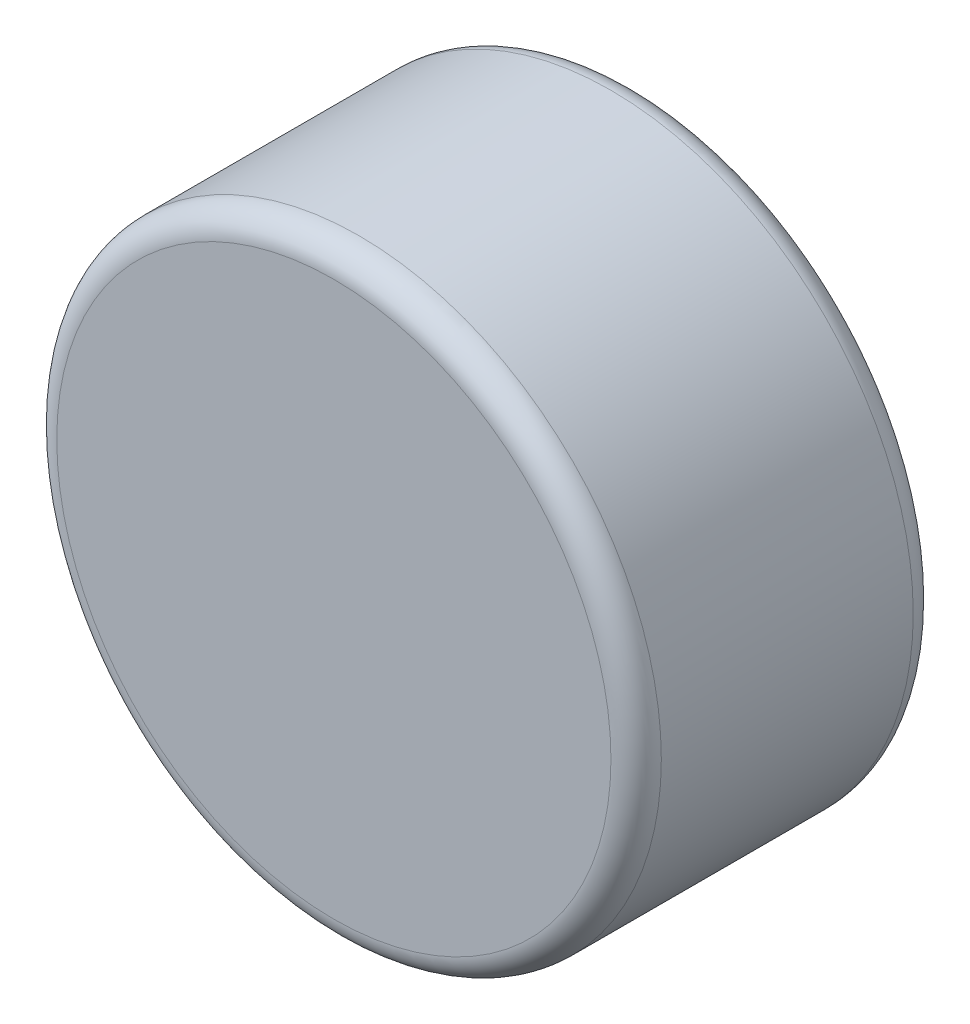
ISO-10303-21;
HEADER;
FILE_DESCRIPTION(('STEP AP214'),'2;1');
FILE_NAME('part.step','',(''),(''),'','','');
FILE_SCHEMA(('AUTOMOTIVE_DESIGN { 1 0 10303 214 1 1 1 1 }'));
ENDSEC;
DATA;
#1=APPLICATION_CONTEXT('core data for automotive mechanical design processes');
#2=APPLICATION_PROTOCOL_DEFINITION('international standard','automotive_design',2000,#1);
#3=PRODUCT_CONTEXT('',#1,'mechanical');
#4=PRODUCT('Part','Part','',(#3));
#5=PRODUCT_RELATED_PRODUCT_CATEGORY('part','',(#4));
#6=PRODUCT_DEFINITION_FORMATION('','',#4);
#7=PRODUCT_DEFINITION_CONTEXT('part definition',#1,'design');
#8=PRODUCT_DEFINITION('design','',#6,#7);
#9=PRODUCT_DEFINITION_SHAPE('','',#8);
#10=(LENGTH_UNIT() NAMED_UNIT(*) SI_UNIT(.MILLI.,.METRE.));
#11=(NAMED_UNIT(*) PLANE_ANGLE_UNIT() SI_UNIT($,.RADIAN.));
#12=(NAMED_UNIT(*) SI_UNIT($,.STERADIAN.) SOLID_ANGLE_UNIT());
#13=UNCERTAINTY_MEASURE_WITH_UNIT(LENGTH_MEASURE(1.E-05),#10,'distance_accuracy_value','');
#14=(GEOMETRIC_REPRESENTATION_CONTEXT(3) GLOBAL_UNCERTAINTY_ASSIGNED_CONTEXT((#13)) GLOBAL_UNIT_ASSIGNED_CONTEXT((#10,
#11,#12)) REPRESENTATION_CONTEXT('',''));
#15=CARTESIAN_POINT('',(0.,0.,0.));
#16=DIRECTION('',(0.,0.,1.));
#17=DIRECTION('',(1.,0.,0.));
#18=AXIS2_PLACEMENT_3D('',#15,#16,#17);
#19=CARTESIAN_POINT('',(0.,0.,1.5));
#20=DIRECTION('',(0.,0.,-1.));
#21=DIRECTION('',(-1.,0.,0.));
#22=AXIS2_PLACEMENT_3D('',#19,#20,#21);
#23=CYLINDRICAL_SURFACE('',#22,3.);
#24=CARTESIAN_POINT('',(0.,0.,-1.25));
#25=DIRECTION('',(0.,0.,1.));
#26=DIRECTION('',(1.,0.,0.));
#27=AXIS2_PLACEMENT_3D('',#24,#25,#26);
#28=CIRCLE('',#27,3.);
#29=CARTESIAN_POINT('',(3.,0.,-1.25));
#30=VERTEX_POINT('',#29);
#31=EDGE_CURVE('E42',#30,#30,#28,.T.);
#32=ORIENTED_EDGE('',*,*,#31,.T.);
#33=EDGE_LOOP('',(#32));
#34=FACE_BOUND('',#33,.T.);
#35=CARTESIAN_POINT('',(0.,0.,1.25));
#36=DIRECTION('',(0.,0.,1.));
#37=DIRECTION('',(1.,0.,0.));
#38=AXIS2_PLACEMENT_3D('',#35,#36,#37);
#39=CIRCLE('',#38,3.);
#40=CARTESIAN_POINT('',(3.,0.,1.25));
#41=VERTEX_POINT('',#40);
#42=EDGE_CURVE('E46',#41,#41,#39,.F.);
#43=ORIENTED_EDGE('',*,*,#42,.T.);
#44=EDGE_LOOP('',(#43));
#45=FACE_BOUND('',#44,.T.);
#46=ADVANCED_FACE('F31',(#34,#45),#23,.T.);
#47=CARTESIAN_POINT('',(0.,0.,1.5));
#48=DIRECTION('',(0.,0.,1.));
#49=DIRECTION('',(1.,0.,0.));
#50=AXIS2_PLACEMENT_3D('',#47,#48,#49);
#51=PLANE('',#50);
#52=CARTESIAN_POINT('',(0.,0.,1.5));
#53=DIRECTION('',(0.,0.,1.));
#54=DIRECTION('',(1.,0.,0.));
#55=AXIS2_PLACEMENT_3D('',#52,#53,#54);
#56=CIRCLE('',#55,2.75);
#57=CARTESIAN_POINT('',(2.75,0.,1.5));
#58=VERTEX_POINT('',#57);
#59=EDGE_CURVE('E10',#58,#58,#56,.T.);
#60=ORIENTED_EDGE('',*,*,#59,.T.);
#61=EDGE_LOOP('',(#60));
#62=FACE_BOUND('',#61,.T.);
#63=ADVANCED_FACE('F62',(#62),#51,.T.);
#64=CARTESIAN_POINT('',(0.,0.,-1.5));
#65=DIRECTION('',(0.,0.,1.));
#66=DIRECTION('',(1.,0.,0.));
#67=AXIS2_PLACEMENT_3D('',#64,#65,#66);
#68=PLANE('',#67);
#69=CARTESIAN_POINT('',(0.,0.,-1.5));
#70=DIRECTION('',(0.,0.,1.));
#71=DIRECTION('',(1.,0.,0.));
#72=AXIS2_PLACEMENT_3D('',#69,#70,#71);
#73=CIRCLE('',#72,2.75);
#74=CARTESIAN_POINT('',(2.75,0.,-1.5));
#75=VERTEX_POINT('',#74);
#76=EDGE_CURVE('E38',#75,#75,#73,.F.);
#77=ORIENTED_EDGE('',*,*,#76,.T.);
#78=EDGE_LOOP('',(#77));
#79=FACE_BOUND('',#78,.T.);
#80=ADVANCED_FACE('F59',(#79),#68,.F.);
#81=CARTESIAN_POINT('',(0.,0.,-1.25));
#82=DIRECTION('',(0.,0.,1.));
#83=DIRECTION('',(1.,0.,0.));
#84=AXIS2_PLACEMENT_3D('',#81,#82,#83);
#85=TOROIDAL_SURFACE('',#84,2.75,0.25);
#86=ORIENTED_EDGE('',*,*,#76,.F.);
#87=EDGE_LOOP('',(#86));
#88=FACE_BOUND('',#87,.T.);
#89=ORIENTED_EDGE('',*,*,#31,.F.);
#90=EDGE_LOOP('',(#89));
#91=FACE_BOUND('',#90,.T.);
#92=ADVANCED_FACE('F55',(#88,#91),#85,.T.);
#93=CARTESIAN_POINT('',(0.,0.,1.25));
#94=DIRECTION('',(0.,0.,1.));
#95=DIRECTION('',(1.,0.,0.));
#96=AXIS2_PLACEMENT_3D('',#93,#94,#95);
#97=TOROIDAL_SURFACE('',#96,2.75,0.25);
#98=ORIENTED_EDGE('',*,*,#42,.F.);
#99=EDGE_LOOP('',(#98));
#100=FACE_BOUND('',#99,.T.);
#101=ORIENTED_EDGE('',*,*,#59,.F.);
#102=EDGE_LOOP('',(#101));
#103=FACE_BOUND('',#102,.T.);
#104=ADVANCED_FACE('F33',(#100,#103),#97,.T.);
#105=CLOSED_SHELL('',(#46,#63,#80,#92,#104));
#106=MANIFOLD_SOLID_BREP('B2',#105);
#107=ADVANCED_BREP_SHAPE_REPRESENTATION('',(#18,#106),#14);
#108=SHAPE_DEFINITION_REPRESENTATION(#9,#107);
ENDSEC;
END-ISO-10303-21;
